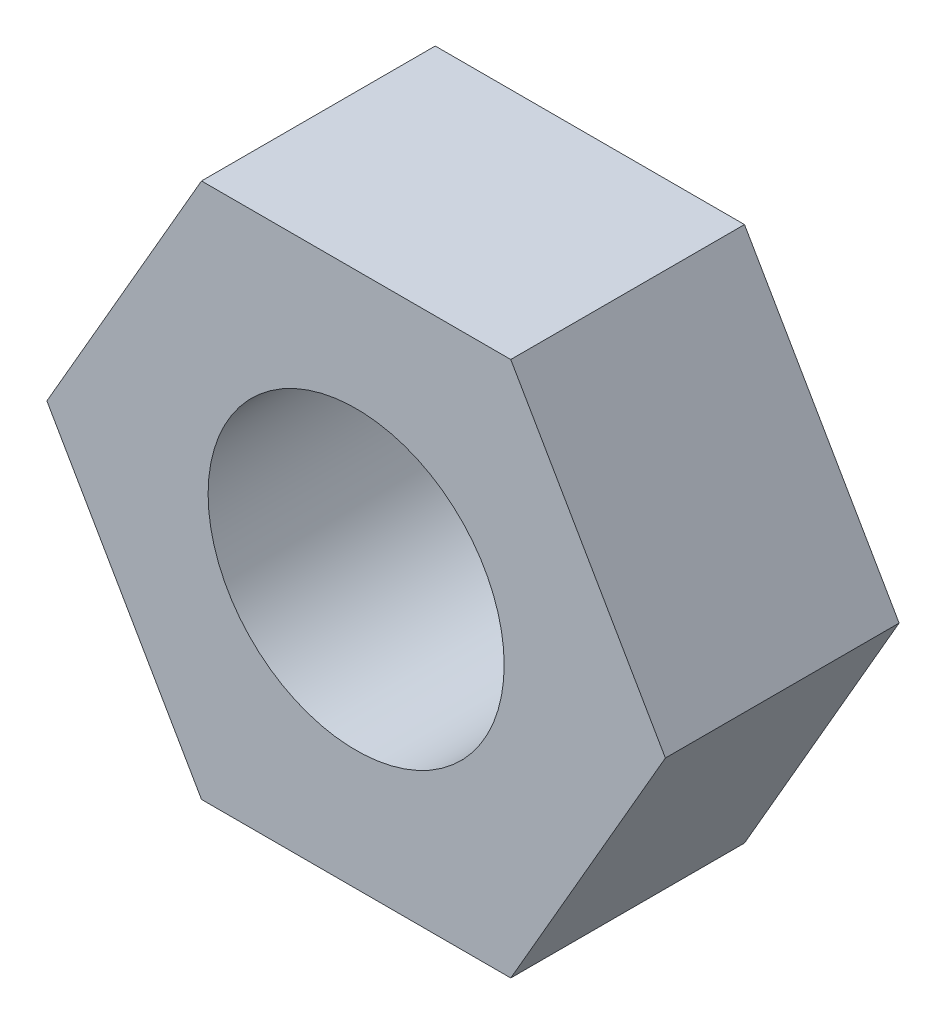
ISO-10303-21;
HEADER;
FILE_DESCRIPTION(('STEP AP214'),'2;1');
FILE_NAME('part.step','',(''),(''),'','','');
FILE_SCHEMA(('AUTOMOTIVE_DESIGN { 1 0 10303 214 1 1 1 1 }'));
ENDSEC;
DATA;
#1=APPLICATION_CONTEXT('core data for automotive mechanical design processes');
#2=APPLICATION_PROTOCOL_DEFINITION('international standard','automotive_design',2000,#1);
#3=PRODUCT_CONTEXT('',#1,'mechanical');
#4=PRODUCT('Part','Part','',(#3));
#5=PRODUCT_RELATED_PRODUCT_CATEGORY('part','',(#4));
#6=PRODUCT_DEFINITION_FORMATION('','',#4);
#7=PRODUCT_DEFINITION_CONTEXT('part definition',#1,'design');
#8=PRODUCT_DEFINITION('design','',#6,#7);
#9=PRODUCT_DEFINITION_SHAPE('','',#8);
#10=(LENGTH_UNIT() NAMED_UNIT(*) SI_UNIT(.MILLI.,.METRE.));
#11=(NAMED_UNIT(*) PLANE_ANGLE_UNIT() SI_UNIT($,.RADIAN.));
#12=(NAMED_UNIT(*) SI_UNIT($,.STERADIAN.) SOLID_ANGLE_UNIT());
#13=UNCERTAINTY_MEASURE_WITH_UNIT(LENGTH_MEASURE(1.E-05),#10,'distance_accuracy_value','');
#14=(GEOMETRIC_REPRESENTATION_CONTEXT(3) GLOBAL_UNCERTAINTY_ASSIGNED_CONTEXT((#13)) GLOBAL_UNIT_ASSIGNED_CONTEXT((#10,
#11,#12)) REPRESENTATION_CONTEXT('',''));
#15=CARTESIAN_POINT('',(0.,0.,0.));
#16=DIRECTION('',(0.,0.,1.));
#17=DIRECTION('',(1.,0.,0.));
#18=AXIS2_PLACEMENT_3D('',#15,#16,#17);
#19=CARTESIAN_POINT('',(1.58771324027147,-2.75,2.4));
#20=DIRECTION('',(-0.866025403784439,0.5,0.));
#21=DIRECTION('',(-0.5,-0.866025403784439,0.));
#22=AXIS2_PLACEMENT_3D('',#19,#20,#21);
#23=PLANE('',#22);
#24=DIRECTION('',(0.5,0.866025403784439,0.));
#25=VECTOR('',#24,1.);
#26=CARTESIAN_POINT('',(1.58771324027147,-2.75,0.));
#27=LINE('',#26,#25);
#28=CARTESIAN_POINT('',(1.58771324027147,-2.75,0.));
#29=VERTEX_POINT('',#28);
#30=CARTESIAN_POINT('',(3.17542648054294,0.,0.));
#31=VERTEX_POINT('',#30);
#32=EDGE_CURVE('E128',#29,#31,#27,.T.);
#33=ORIENTED_EDGE('',*,*,#32,.T.);
#34=DIRECTION('',(0.,0.,-1.));
#35=VECTOR('',#34,1.);
#36=CARTESIAN_POINT('',(3.17542648054294,0.,2.4));
#37=LINE('',#36,#35);
#38=CARTESIAN_POINT('',(3.17542648054294,0.,2.4));
#39=VERTEX_POINT('',#38);
#40=EDGE_CURVE('E11',#39,#31,#37,.T.);
#41=ORIENTED_EDGE('',*,*,#40,.F.);
#42=DIRECTION('',(0.5,0.866025403784439,0.));
#43=VECTOR('',#42,1.);
#44=CARTESIAN_POINT('',(1.58771324027147,-2.75,2.4));
#45=LINE('',#44,#43);
#46=CARTESIAN_POINT('',(1.58771324027147,-2.75,2.4));
#47=VERTEX_POINT('',#46);
#48=EDGE_CURVE('E139',#47,#39,#45,.T.);
#49=ORIENTED_EDGE('',*,*,#48,.F.);
#50=DIRECTION('',(0.,0.,-1.));
#51=VECTOR('',#50,1.);
#52=CARTESIAN_POINT('',(1.58771324027147,-2.75,2.4));
#53=LINE('',#52,#51);
#54=EDGE_CURVE('E124',#47,#29,#53,.T.);
#55=ORIENTED_EDGE('',*,*,#54,.T.);
#56=EDGE_LOOP('',(#33,#41,#49,#55));
#57=FACE_BOUND('',#56,.T.);
#58=ADVANCED_FACE('F43',(#57),#23,.F.);
#59=CARTESIAN_POINT('',(3.17542648054294,0.,2.4));
#60=DIRECTION('',(-0.866025403784439,-0.5,0.));
#61=DIRECTION('',(0.5,-0.866025403784439,0.));
#62=AXIS2_PLACEMENT_3D('',#59,#60,#61);
#63=PLANE('',#62);
#64=DIRECTION('',(-0.5,0.866025403784439,0.));
#65=VECTOR('',#64,1.);
#66=CARTESIAN_POINT('',(3.17542648054294,0.,0.));
#67=LINE('',#66,#65);
#68=CARTESIAN_POINT('',(1.58771324027147,2.75,0.));
#69=VERTEX_POINT('',#68);
#70=EDGE_CURVE('E131',#31,#69,#67,.T.);
#71=ORIENTED_EDGE('',*,*,#70,.T.);
#72=DIRECTION('',(0.,0.,-1.));
#73=VECTOR('',#72,1.);
#74=CARTESIAN_POINT('',(1.58771324027147,2.75,2.4));
#75=LINE('',#74,#73);
#76=CARTESIAN_POINT('',(1.58771324027147,2.75,2.4));
#77=VERTEX_POINT('',#76);
#78=EDGE_CURVE('E52',#77,#69,#75,.T.);
#79=ORIENTED_EDGE('',*,*,#78,.F.);
#80=DIRECTION('',(-0.5,0.866025403784439,0.));
#81=VECTOR('',#80,1.);
#82=CARTESIAN_POINT('',(3.17542648054294,0.,2.4));
#83=LINE('',#82,#81);
#84=EDGE_CURVE('E97',#39,#77,#83,.T.);
#85=ORIENTED_EDGE('',*,*,#84,.F.);
#86=ORIENTED_EDGE('',*,*,#40,.T.);
#87=EDGE_LOOP('',(#71,#79,#85,#86));
#88=FACE_BOUND('',#87,.T.);
#89=ADVANCED_FACE('F165',(#88),#63,.F.);
#90=CARTESIAN_POINT('',(1.58771324027147,2.75,2.4));
#91=DIRECTION('',(0.,-1.,0.));
#92=DIRECTION('',(1.,0.,0.));
#93=AXIS2_PLACEMENT_3D('',#90,#91,#92);
#94=PLANE('',#93);
#95=DIRECTION('',(-1.,0.,0.));
#96=VECTOR('',#95,1.);
#97=CARTESIAN_POINT('',(1.58771324027147,2.75,0.));
#98=LINE('',#97,#96);
#99=CARTESIAN_POINT('',(-1.58771324027147,2.75,0.));
#100=VERTEX_POINT('',#99);
#101=EDGE_CURVE('E134',#69,#100,#98,.T.);
#102=ORIENTED_EDGE('',*,*,#101,.T.);
#103=DIRECTION('',(0.,0.,-1.));
#104=VECTOR('',#103,1.);
#105=CARTESIAN_POINT('',(-1.58771324027147,2.75,2.4));
#106=LINE('',#105,#104);
#107=CARTESIAN_POINT('',(-1.58771324027147,2.75,2.4));
#108=VERTEX_POINT('',#107);
#109=EDGE_CURVE('E119',#108,#100,#106,.T.);
#110=ORIENTED_EDGE('',*,*,#109,.F.);
#111=DIRECTION('',(-1.,0.,0.));
#112=VECTOR('',#111,1.);
#113=CARTESIAN_POINT('',(1.58771324027147,2.75,2.4));
#114=LINE('',#113,#112);
#115=EDGE_CURVE('E110',#77,#108,#114,.T.);
#116=ORIENTED_EDGE('',*,*,#115,.F.);
#117=ORIENTED_EDGE('',*,*,#78,.T.);
#118=EDGE_LOOP('',(#102,#110,#116,#117));
#119=FACE_BOUND('',#118,.T.);
#120=ADVANCED_FACE('F146',(#119),#94,.F.);
#121=CARTESIAN_POINT('',(-1.58771324027147,2.75,2.4));
#122=DIRECTION('',(0.866025403784439,-0.5,0.));
#123=DIRECTION('',(0.5,0.866025403784439,0.));
#124=AXIS2_PLACEMENT_3D('',#121,#122,#123);
#125=PLANE('',#124);
#126=DIRECTION('',(-0.5,-0.866025403784438,0.));
#127=VECTOR('',#126,1.);
#128=CARTESIAN_POINT('',(-1.58771324027147,2.75,0.));
#129=LINE('',#128,#127);
#130=CARTESIAN_POINT('',(-3.17542648054294,0.,0.));
#131=VERTEX_POINT('',#130);
#132=EDGE_CURVE('E118',#100,#131,#129,.T.);
#133=ORIENTED_EDGE('',*,*,#132,.T.);
#134=DIRECTION('',(0.,0.,-1.));
#135=VECTOR('',#134,1.);
#136=CARTESIAN_POINT('',(-3.17542648054294,0.,2.4));
#137=LINE('',#136,#135);
#138=CARTESIAN_POINT('',(-3.17542648054294,0.,2.4));
#139=VERTEX_POINT('',#138);
#140=EDGE_CURVE('E115',#139,#131,#137,.T.);
#141=ORIENTED_EDGE('',*,*,#140,.F.);
#142=DIRECTION('',(-0.5,-0.866025403784438,0.));
#143=VECTOR('',#142,1.);
#144=CARTESIAN_POINT('',(-1.58771324027147,2.75,2.4));
#145=LINE('',#144,#143);
#146=EDGE_CURVE('E104',#108,#139,#145,.T.);
#147=ORIENTED_EDGE('',*,*,#146,.F.);
#148=ORIENTED_EDGE('',*,*,#109,.T.);
#149=EDGE_LOOP('',(#133,#141,#147,#148));
#150=FACE_BOUND('',#149,.T.);
#151=ADVANCED_FACE('F116',(#150),#125,.F.);
#152=CARTESIAN_POINT('',(-3.17542648054294,0.,2.4));
#153=DIRECTION('',(0.866025403784439,0.5,0.));
#154=DIRECTION('',(-0.5,0.866025403784439,0.));
#155=AXIS2_PLACEMENT_3D('',#152,#153,#154);
#156=PLANE('',#155);
#157=DIRECTION('',(0.5,-0.866025403784439,0.));
#158=VECTOR('',#157,1.);
#159=CARTESIAN_POINT('',(-3.17542648054294,0.,0.));
#160=LINE('',#159,#158);
#161=CARTESIAN_POINT('',(-1.58771324027147,-2.75,0.));
#162=VERTEX_POINT('',#161);
#163=EDGE_CURVE('E83',#131,#162,#160,.T.);
#164=ORIENTED_EDGE('',*,*,#163,.T.);
#165=DIRECTION('',(0.,0.,-1.));
#166=VECTOR('',#165,1.);
#167=CARTESIAN_POINT('',(-1.58771324027147,-2.75,2.4));
#168=LINE('',#167,#166);
#169=CARTESIAN_POINT('',(-1.58771324027147,-2.75,2.4));
#170=VERTEX_POINT('',#169);
#171=EDGE_CURVE('E120',#170,#162,#168,.T.);
#172=ORIENTED_EDGE('',*,*,#171,.F.);
#173=DIRECTION('',(0.5,-0.866025403784439,0.));
#174=VECTOR('',#173,1.);
#175=CARTESIAN_POINT('',(-3.17542648054294,0.,2.4));
#176=LINE('',#175,#174);
#177=EDGE_CURVE('E108',#139,#170,#176,.T.);
#178=ORIENTED_EDGE('',*,*,#177,.F.);
#179=ORIENTED_EDGE('',*,*,#140,.T.);
#180=EDGE_LOOP('',(#164,#172,#178,#179));
#181=FACE_BOUND('',#180,.T.);
#182=ADVANCED_FACE('F122',(#181),#156,.F.);
#183=CARTESIAN_POINT('',(-1.58771324027147,-2.75,2.4));
#184=DIRECTION('',(0.,1.,0.));
#185=DIRECTION('',(-1.,0.,0.));
#186=AXIS2_PLACEMENT_3D('',#183,#184,#185);
#187=PLANE('',#186);
#188=DIRECTION('',(1.,0.,0.));
#189=VECTOR('',#188,1.);
#190=CARTESIAN_POINT('',(-1.58771324027147,-2.75,0.));
#191=LINE('',#190,#189);
#192=EDGE_CURVE('E89',#162,#29,#191,.T.);
#193=ORIENTED_EDGE('',*,*,#192,.T.);
#194=ORIENTED_EDGE('',*,*,#54,.F.);
#195=DIRECTION('',(1.,0.,0.));
#196=VECTOR('',#195,1.);
#197=CARTESIAN_POINT('',(-1.58771324027147,-2.75,2.4));
#198=LINE('',#197,#196);
#199=EDGE_CURVE('E60',#170,#47,#198,.T.);
#200=ORIENTED_EDGE('',*,*,#199,.F.);
#201=ORIENTED_EDGE('',*,*,#171,.T.);
#202=EDGE_LOOP('',(#193,#194,#200,#201));
#203=FACE_BOUND('',#202,.T.);
#204=ADVANCED_FACE('F153',(#203),#187,.F.);
#205=CARTESIAN_POINT('',(0.,0.,2.4));
#206=DIRECTION('',(0.,0.,1.));
#207=DIRECTION('',(1.,0.,0.));
#208=AXIS2_PLACEMENT_3D('',#205,#206,#207);
#209=PLANE('',#208);
#210=CARTESIAN_POINT('',(0.,0.,2.4));
#211=DIRECTION('',(0.,0.,1.));
#212=DIRECTION('',(1.,0.,0.));
#213=AXIS2_PLACEMENT_3D('',#210,#211,#212);
#214=CIRCLE('',#213,1.52);
#215=CARTESIAN_POINT('',(1.52,0.,2.4));
#216=VERTEX_POINT('',#215);
#217=EDGE_CURVE('E132',#216,#216,#214,.F.);
#218=ORIENTED_EDGE('',*,*,#217,.T.);
#219=EDGE_LOOP('',(#218));
#220=FACE_BOUND('',#219,.T.);
#221=ORIENTED_EDGE('',*,*,#48,.T.);
#222=ORIENTED_EDGE('',*,*,#84,.T.);
#223=ORIENTED_EDGE('',*,*,#115,.T.);
#224=ORIENTED_EDGE('',*,*,#146,.T.);
#225=ORIENTED_EDGE('',*,*,#177,.T.);
#226=ORIENTED_EDGE('',*,*,#199,.T.);
#227=EDGE_LOOP('',(#221,#222,#223,#224,#225,#226));
#228=FACE_BOUND('',#227,.T.);
#229=ADVANCED_FACE('F106',(#220,#228),#209,.T.);
#230=CARTESIAN_POINT('',(0.,0.,0.));
#231=DIRECTION('',(0.,0.,1.));
#232=DIRECTION('',(1.,0.,0.));
#233=AXIS2_PLACEMENT_3D('',#230,#231,#232);
#234=PLANE('',#233);
#235=CARTESIAN_POINT('',(0.,0.,0.));
#236=DIRECTION('',(0.,0.,1.));
#237=DIRECTION('',(1.,0.,0.));
#238=AXIS2_PLACEMENT_3D('',#235,#236,#237);
#239=CIRCLE('',#238,1.52);
#240=CARTESIAN_POINT('',(1.52,0.,0.));
#241=VERTEX_POINT('',#240);
#242=EDGE_CURVE('E46',#241,#241,#239,.F.);
#243=ORIENTED_EDGE('',*,*,#242,.F.);
#244=EDGE_LOOP('',(#243));
#245=FACE_BOUND('',#244,.T.);
#246=ORIENTED_EDGE('',*,*,#32,.F.);
#247=ORIENTED_EDGE('',*,*,#192,.F.);
#248=ORIENTED_EDGE('',*,*,#163,.F.);
#249=ORIENTED_EDGE('',*,*,#132,.F.);
#250=ORIENTED_EDGE('',*,*,#101,.F.);
#251=ORIENTED_EDGE('',*,*,#70,.F.);
#252=EDGE_LOOP('',(#246,#247,#248,#249,#250,#251));
#253=FACE_BOUND('',#252,.T.);
#254=ADVANCED_FACE('F149',(#245,#253),#234,.F.);
#255=CARTESIAN_POINT('',(0.,0.,3.4));
#256=DIRECTION('',(0.,0.,-1.));
#257=DIRECTION('',(-1.,0.,0.));
#258=AXIS2_PLACEMENT_3D('',#255,#256,#257);
#259=CYLINDRICAL_SURFACE('',#258,1.52);
#260=ORIENTED_EDGE('',*,*,#217,.F.);
#261=EDGE_LOOP('',(#260));
#262=FACE_BOUND('',#261,.T.);
#263=ORIENTED_EDGE('',*,*,#242,.T.);
#264=EDGE_LOOP('',(#263));
#265=FACE_BOUND('',#264,.T.);
#266=ADVANCED_FACE('F204',(#262,#265),#259,.F.);
#267=CLOSED_SHELL('',(#58,#89,#120,#151,#182,#204,#229,#254,#266));
#268=MANIFOLD_SOLID_BREP('B2',#267);
#269=ADVANCED_BREP_SHAPE_REPRESENTATION('',(#18,#268),#14);
#270=SHAPE_DEFINITION_REPRESENTATION(#9,#269);
ENDSEC;
END-ISO-10303-21;
